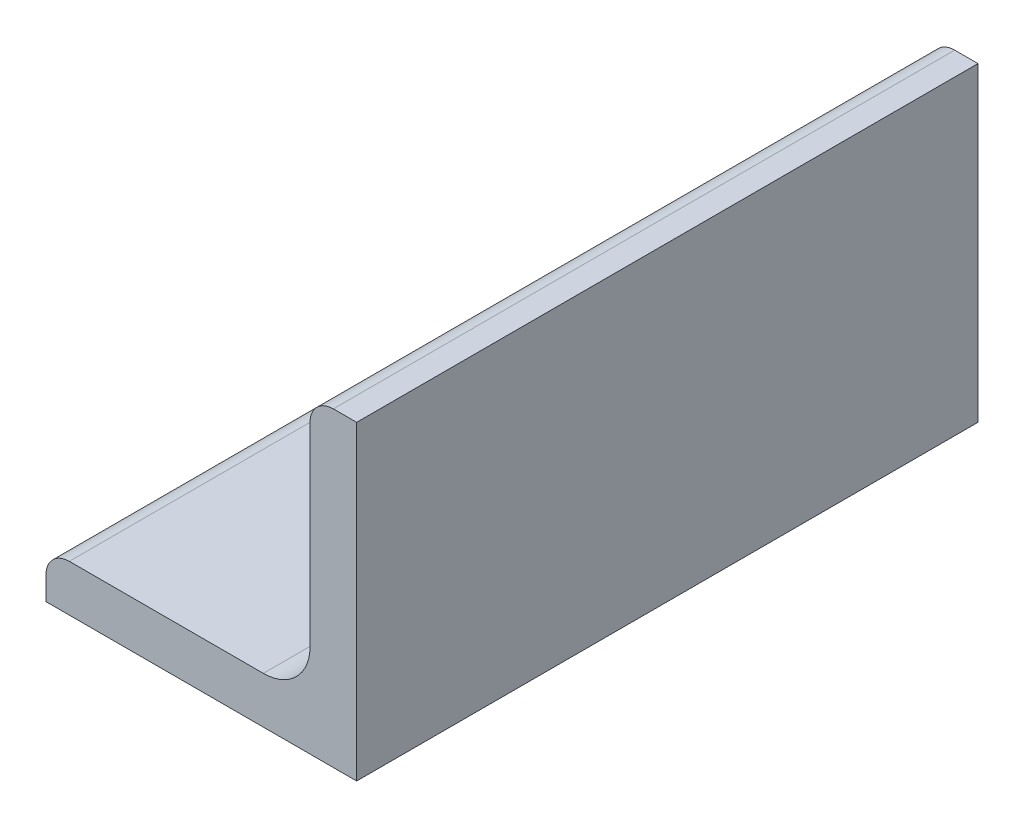
ISO-10303-21;
HEADER;
FILE_DESCRIPTION(('STEP AP214'),'2;1');
FILE_NAME('part.step','',(''),(''),'','','');
FILE_SCHEMA(('AUTOMOTIVE_DESIGN { 1 0 10303 214 1 1 1 1 }'));
ENDSEC;
DATA;
#1=APPLICATION_CONTEXT('core data for automotive mechanical design processes');
#2=APPLICATION_PROTOCOL_DEFINITION('international standard','automotive_design',2000,#1);
#3=PRODUCT_CONTEXT('',#1,'mechanical');
#4=PRODUCT('Part','Part','',(#3));
#5=PRODUCT_RELATED_PRODUCT_CATEGORY('part','',(#4));
#6=PRODUCT_DEFINITION_FORMATION('','',#4);
#7=PRODUCT_DEFINITION_CONTEXT('part definition',#1,'design');
#8=PRODUCT_DEFINITION('design','',#6,#7);
#9=PRODUCT_DEFINITION_SHAPE('','',#8);
#10=(LENGTH_UNIT() NAMED_UNIT(*) SI_UNIT(.MILLI.,.METRE.));
#11=(NAMED_UNIT(*) PLANE_ANGLE_UNIT() SI_UNIT($,.RADIAN.));
#12=(NAMED_UNIT(*) SI_UNIT($,.STERADIAN.) SOLID_ANGLE_UNIT());
#13=UNCERTAINTY_MEASURE_WITH_UNIT(LENGTH_MEASURE(1.E-05),#10,'distance_accuracy_value','');
#14=(GEOMETRIC_REPRESENTATION_CONTEXT(3) GLOBAL_UNCERTAINTY_ASSIGNED_CONTEXT((#13)) GLOBAL_UNIT_ASSIGNED_CONTEXT((#10,
#11,#12)) REPRESENTATION_CONTEXT('',''));
#15=CARTESIAN_POINT('',(0.,0.,0.));
#16=DIRECTION('',(0.,0.,1.));
#17=DIRECTION('',(1.,0.,0.));
#18=AXIS2_PLACEMENT_3D('',#15,#16,#17);
#19=CARTESIAN_POINT('',(-15.875,-13.49375,152.4));
#20=DIRECTION('',(1.,0.,0.));
#21=DIRECTION('',(0.,0.,-1.));
#22=AXIS2_PLACEMENT_3D('',#19,#20,#21);
#23=PLANE('',#22);
#24=DIRECTION('',(0.,0.,-1.));
#25=VECTOR('',#24,1.);
#26=CARTESIAN_POINT('',(-15.875,-13.49375,152.4));
#27=LINE('',#26,#25);
#28=CARTESIAN_POINT('',(-15.875,-13.49375,152.4));
#29=VERTEX_POINT('',#28);
#30=CARTESIAN_POINT('',(-15.875,-13.49375,88.9));
#31=VERTEX_POINT('',#30);
#32=EDGE_CURVE('E150',#29,#31,#27,.T.);
#33=ORIENTED_EDGE('',*,*,#32,.T.);
#34=DIRECTION('',(0.,-1.,0.));
#35=VECTOR('',#34,1.);
#36=CARTESIAN_POINT('',(-15.875,-13.49375,88.9));
#37=LINE('',#36,#35);
#38=CARTESIAN_POINT('',(-15.875,-15.875,88.9));
#39=VERTEX_POINT('',#38);
#40=EDGE_CURVE('E55',#31,#39,#37,.T.);
#41=ORIENTED_EDGE('',*,*,#40,.T.);
#42=DIRECTION('',(0.,0.,-1.));
#43=VECTOR('',#42,1.);
#44=CARTESIAN_POINT('',(-15.875,-15.875,152.4));
#45=LINE('',#44,#43);
#46=CARTESIAN_POINT('',(-15.875,-15.875,152.4));
#47=VERTEX_POINT('',#46);
#48=EDGE_CURVE('E48',#47,#39,#45,.T.);
#49=ORIENTED_EDGE('',*,*,#48,.F.);
#50=DIRECTION('',(0.,-1.,0.));
#51=VECTOR('',#50,1.);
#52=CARTESIAN_POINT('',(-15.875,-13.49375,152.4));
#53=LINE('',#52,#51);
#54=EDGE_CURVE('E167',#29,#47,#53,.T.);
#55=ORIENTED_EDGE('',*,*,#54,.F.);
#56=EDGE_LOOP('',(#33,#41,#49,#55));
#57=FACE_BOUND('',#56,.T.);
#58=ADVANCED_FACE('F41',(#57),#23,.F.);
#59=CARTESIAN_POINT('',(-15.875,-15.875,152.4));
#60=DIRECTION('',(0.,1.,0.));
#61=DIRECTION('',(-1.,0.,0.));
#62=AXIS2_PLACEMENT_3D('',#59,#60,#61);
#63=PLANE('',#62);
#64=ORIENTED_EDGE('',*,*,#48,.T.);
#65=DIRECTION('',(-1.,0.,0.));
#66=VECTOR('',#65,1.);
#67=CARTESIAN_POINT('',(15.875,-15.875,88.9));
#68=LINE('',#67,#66);
#69=CARTESIAN_POINT('',(15.875,-15.875,88.9));
#70=VERTEX_POINT('',#69);
#71=EDGE_CURVE('E112',#70,#39,#68,.T.);
#72=ORIENTED_EDGE('',*,*,#71,.F.);
#73=DIRECTION('',(0.,0.,-1.));
#74=VECTOR('',#73,1.);
#75=CARTESIAN_POINT('',(15.875,-15.875,152.4));
#76=LINE('',#75,#74);
#77=CARTESIAN_POINT('',(15.875,-15.875,152.4));
#78=VERTEX_POINT('',#77);
#79=EDGE_CURVE('E124',#78,#70,#76,.T.);
#80=ORIENTED_EDGE('',*,*,#79,.F.);
#81=DIRECTION('',(1.,0.,0.));
#82=VECTOR('',#81,1.);
#83=CARTESIAN_POINT('',(-15.875,-15.875,152.4));
#84=LINE('',#83,#82);
#85=EDGE_CURVE('E165',#47,#78,#84,.T.);
#86=ORIENTED_EDGE('',*,*,#85,.F.);
#87=EDGE_LOOP('',(#64,#72,#80,#86));
#88=FACE_BOUND('',#87,.T.);
#89=ADVANCED_FACE('F123',(#88),#63,.F.);
#90=CARTESIAN_POINT('',(15.875,-15.875,152.4));
#91=DIRECTION('',(-1.,0.,0.));
#92=DIRECTION('',(0.,-1.,0.));
#93=AXIS2_PLACEMENT_3D('',#90,#91,#92);
#94=PLANE('',#93);
#95=ORIENTED_EDGE('',*,*,#79,.T.);
#96=DIRECTION('',(0.,-1.,0.));
#97=VECTOR('',#96,1.);
#98=CARTESIAN_POINT('',(15.875,-15.875,88.9));
#99=LINE('',#98,#97);
#100=CARTESIAN_POINT('',(15.875,15.875,88.9));
#101=VERTEX_POINT('',#100);
#102=EDGE_CURVE('E109',#101,#70,#99,.T.);
#103=ORIENTED_EDGE('',*,*,#102,.F.);
#104=DIRECTION('',(0.,0.,-1.));
#105=VECTOR('',#104,1.);
#106=CARTESIAN_POINT('',(15.875,15.875,152.4));
#107=LINE('',#106,#105);
#108=CARTESIAN_POINT('',(15.875,15.875,152.4));
#109=VERTEX_POINT('',#108);
#110=EDGE_CURVE('E131',#109,#101,#107,.T.);
#111=ORIENTED_EDGE('',*,*,#110,.F.);
#112=DIRECTION('',(0.,1.,0.));
#113=VECTOR('',#112,1.);
#114=CARTESIAN_POINT('',(15.875,-15.875,152.4));
#115=LINE('',#114,#113);
#116=EDGE_CURVE('E130',#78,#109,#115,.T.);
#117=ORIENTED_EDGE('',*,*,#116,.F.);
#118=EDGE_LOOP('',(#95,#103,#111,#117));
#119=FACE_BOUND('',#118,.T.);
#120=ADVANCED_FACE('F129',(#119),#94,.F.);
#121=CARTESIAN_POINT('',(13.49375,15.875,152.4));
#122=DIRECTION('',(0.,-1.,0.));
#123=DIRECTION('',(1.,0.,0.));
#124=AXIS2_PLACEMENT_3D('',#121,#122,#123);
#125=PLANE('',#124);
#126=ORIENTED_EDGE('',*,*,#110,.T.);
#127=DIRECTION('',(-1.,0.,0.));
#128=VECTOR('',#127,1.);
#129=CARTESIAN_POINT('',(13.49375,15.875,88.9));
#130=LINE('',#129,#128);
#131=CARTESIAN_POINT('',(13.49375,15.875,88.9));
#132=VERTEX_POINT('',#131);
#133=EDGE_CURVE('E114',#101,#132,#130,.T.);
#134=ORIENTED_EDGE('',*,*,#133,.T.);
#135=DIRECTION('',(0.,0.,-1.));
#136=VECTOR('',#135,1.);
#137=CARTESIAN_POINT('',(13.49375,15.875,152.4));
#138=LINE('',#137,#136);
#139=CARTESIAN_POINT('',(13.49375,15.875,152.4));
#140=VERTEX_POINT('',#139);
#141=EDGE_CURVE('E133',#140,#132,#138,.T.);
#142=ORIENTED_EDGE('',*,*,#141,.F.);
#143=DIRECTION('',(-1.,0.,0.));
#144=VECTOR('',#143,1.);
#145=CARTESIAN_POINT('',(13.49375,15.875,152.4));
#146=LINE('',#145,#144);
#147=EDGE_CURVE('E162',#109,#140,#146,.T.);
#148=ORIENTED_EDGE('',*,*,#147,.F.);
#149=EDGE_LOOP('',(#126,#134,#142,#148));
#150=FACE_BOUND('',#149,.T.);
#151=ADVANCED_FACE('F194',(#150),#125,.F.);
#152=CARTESIAN_POINT('',(13.49375,13.49375,152.4));
#153=DIRECTION('',(0.,0.,-1.));
#154=DIRECTION('',(-1.,0.,0.));
#155=AXIS2_PLACEMENT_3D('',#152,#153,#154);
#156=CYLINDRICAL_SURFACE('',#155,2.38125);
#157=ORIENTED_EDGE('',*,*,#141,.T.);
#158=CARTESIAN_POINT('',(13.49375,13.49375,88.9));
#159=DIRECTION('',(0.,0.,1.));
#160=DIRECTION('',(1.,0.,0.));
#161=AXIS2_PLACEMENT_3D('',#158,#159,#160);
#162=CIRCLE('',#161,2.38125);
#163=CARTESIAN_POINT('',(11.1125,13.49375,88.9));
#164=VERTEX_POINT('',#163);
#165=EDGE_CURVE('E171',#132,#164,#162,.T.);
#166=ORIENTED_EDGE('',*,*,#165,.T.);
#167=DIRECTION('',(0.,0.,-1.));
#168=VECTOR('',#167,1.);
#169=CARTESIAN_POINT('',(11.1125,13.49375,152.4));
#170=LINE('',#169,#168);
#171=CARTESIAN_POINT('',(11.1125,13.49375,152.4));
#172=VERTEX_POINT('',#171);
#173=EDGE_CURVE('E138',#172,#164,#170,.T.);
#174=ORIENTED_EDGE('',*,*,#173,.F.);
#175=CARTESIAN_POINT('',(13.49375,13.49375,152.4));
#176=DIRECTION('',(0.,0.,1.));
#177=DIRECTION('',(-1.,0.,0.));
#178=AXIS2_PLACEMENT_3D('',#175,#176,#177);
#179=CIRCLE('',#178,2.38125);
#180=EDGE_CURVE('E160',#140,#172,#179,.T.);
#181=ORIENTED_EDGE('',*,*,#180,.F.);
#182=EDGE_LOOP('',(#157,#166,#174,#181));
#183=FACE_BOUND('',#182,.T.);
#184=ADVANCED_FACE('F198',(#183),#156,.T.);
#185=CARTESIAN_POINT('',(11.1125,13.49375,152.4));
#186=DIRECTION('',(1.,0.,0.));
#187=DIRECTION('',(0.,1.,0.));
#188=AXIS2_PLACEMENT_3D('',#185,#186,#187);
#189=PLANE('',#188);
#190=ORIENTED_EDGE('',*,*,#173,.T.);
#191=DIRECTION('',(0.,-1.,0.));
#192=VECTOR('',#191,1.);
#193=CARTESIAN_POINT('',(11.1125,13.49375,88.9));
#194=LINE('',#193,#192);
#195=CARTESIAN_POINT('',(11.1125,-6.33729999999999,88.9));
#196=VERTEX_POINT('',#195);
#197=EDGE_CURVE('E174',#164,#196,#194,.T.);
#198=ORIENTED_EDGE('',*,*,#197,.T.);
#199=DIRECTION('',(0.,0.,-1.));
#200=VECTOR('',#199,1.);
#201=CARTESIAN_POINT('',(11.1125,-6.33729999999999,152.4));
#202=LINE('',#201,#200);
#203=CARTESIAN_POINT('',(11.1125,-6.33729999999999,152.4));
#204=VERTEX_POINT('',#203);
#205=EDGE_CURVE('E141',#204,#196,#202,.T.);
#206=ORIENTED_EDGE('',*,*,#205,.F.);
#207=DIRECTION('',(0.,-1.,0.));
#208=VECTOR('',#207,1.);
#209=CARTESIAN_POINT('',(11.1125,13.49375,152.4));
#210=LINE('',#209,#208);
#211=EDGE_CURVE('E158',#172,#204,#210,.T.);
#212=ORIENTED_EDGE('',*,*,#211,.F.);
#213=EDGE_LOOP('',(#190,#198,#206,#212));
#214=FACE_BOUND('',#213,.T.);
#215=ADVANCED_FACE('F203',(#214),#189,.F.);
#216=CARTESIAN_POINT('',(6.3373,-6.33729999999999,152.4));
#217=DIRECTION('',(0.,0.,-1.));
#218=DIRECTION('',(-1.,0.,0.));
#219=AXIS2_PLACEMENT_3D('',#216,#217,#218);
#220=CYLINDRICAL_SURFACE('',#219,4.7752);
#221=ORIENTED_EDGE('',*,*,#205,.T.);
#222=CARTESIAN_POINT('',(6.3373,-6.33729999999999,88.9));
#223=DIRECTION('',(0.,0.,1.));
#224=DIRECTION('',(1.,0.,0.));
#225=AXIS2_PLACEMENT_3D('',#222,#223,#224);
#226=CIRCLE('',#225,4.7752);
#227=CARTESIAN_POINT('',(6.3373,-11.1125,88.9));
#228=VERTEX_POINT('',#227);
#229=EDGE_CURVE('E177',#196,#228,#226,.F.);
#230=ORIENTED_EDGE('',*,*,#229,.T.);
#231=DIRECTION('',(0.,0.,-1.));
#232=VECTOR('',#231,1.);
#233=CARTESIAN_POINT('',(6.3373,-11.1125,152.4));
#234=LINE('',#233,#232);
#235=CARTESIAN_POINT('',(6.3373,-11.1125,152.4));
#236=VERTEX_POINT('',#235);
#237=EDGE_CURVE('E144',#236,#228,#234,.T.);
#238=ORIENTED_EDGE('',*,*,#237,.F.);
#239=CARTESIAN_POINT('',(6.3373,-6.33729999999999,152.4));
#240=DIRECTION('',(0.,0.,-1.));
#241=DIRECTION('',(-1.,0.,0.));
#242=AXIS2_PLACEMENT_3D('',#239,#240,#241);
#243=CIRCLE('',#242,4.7752);
#244=EDGE_CURVE('E156',#204,#236,#243,.T.);
#245=ORIENTED_EDGE('',*,*,#244,.F.);
#246=EDGE_LOOP('',(#221,#230,#238,#245));
#247=FACE_BOUND('',#246,.T.);
#248=ADVANCED_FACE('F205',(#247),#220,.F.);
#249=CARTESIAN_POINT('',(6.3373,-11.1125,152.4));
#250=DIRECTION('',(0.,-1.,0.));
#251=DIRECTION('',(1.,0.,0.));
#252=AXIS2_PLACEMENT_3D('',#249,#250,#251);
#253=PLANE('',#252);
#254=ORIENTED_EDGE('',*,*,#237,.T.);
#255=DIRECTION('',(-1.,0.,0.));
#256=VECTOR('',#255,1.);
#257=CARTESIAN_POINT('',(6.3373,-11.1125,88.9));
#258=LINE('',#257,#256);
#259=CARTESIAN_POINT('',(-13.49375,-11.1125,88.9));
#260=VERTEX_POINT('',#259);
#261=EDGE_CURVE('E127',#228,#260,#258,.T.);
#262=ORIENTED_EDGE('',*,*,#261,.T.);
#263=DIRECTION('',(0.,0.,-1.));
#264=VECTOR('',#263,1.);
#265=CARTESIAN_POINT('',(-13.49375,-11.1125,152.4));
#266=LINE('',#265,#264);
#267=CARTESIAN_POINT('',(-13.49375,-11.1125,152.4));
#268=VERTEX_POINT('',#267);
#269=EDGE_CURVE('E147',#268,#260,#266,.T.);
#270=ORIENTED_EDGE('',*,*,#269,.F.);
#271=DIRECTION('',(-1.,0.,0.));
#272=VECTOR('',#271,1.);
#273=CARTESIAN_POINT('',(6.3373,-11.1125,152.4));
#274=LINE('',#273,#272);
#275=EDGE_CURVE('E154',#236,#268,#274,.T.);
#276=ORIENTED_EDGE('',*,*,#275,.F.);
#277=EDGE_LOOP('',(#254,#262,#270,#276));
#278=FACE_BOUND('',#277,.T.);
#279=ADVANCED_FACE('F183',(#278),#253,.F.);
#280=CARTESIAN_POINT('',(-13.49375,-13.49375,152.4));
#281=DIRECTION('',(0.,0.,-1.));
#282=DIRECTION('',(-1.,0.,0.));
#283=AXIS2_PLACEMENT_3D('',#280,#281,#282);
#284=CYLINDRICAL_SURFACE('',#283,2.38125);
#285=ORIENTED_EDGE('',*,*,#269,.T.);
#286=CARTESIAN_POINT('',(-13.49375,-13.49375,88.9));
#287=DIRECTION('',(0.,0.,1.));
#288=DIRECTION('',(1.,0.,0.));
#289=AXIS2_PLACEMENT_3D('',#286,#287,#288);
#290=CIRCLE('',#289,2.38125);
#291=EDGE_CURVE('E11',#260,#31,#290,.T.);
#292=ORIENTED_EDGE('',*,*,#291,.T.);
#293=ORIENTED_EDGE('',*,*,#32,.F.);
#294=CARTESIAN_POINT('',(-13.49375,-13.49375,152.4));
#295=DIRECTION('',(0.,0.,1.));
#296=DIRECTION('',(-1.,0.,0.));
#297=AXIS2_PLACEMENT_3D('',#294,#295,#296);
#298=CIRCLE('',#297,2.38125);
#299=EDGE_CURVE('E62',#268,#29,#298,.T.);
#300=ORIENTED_EDGE('',*,*,#299,.F.);
#301=EDGE_LOOP('',(#285,#292,#293,#300));
#302=FACE_BOUND('',#301,.T.);
#303=ADVANCED_FACE('F187',(#302),#284,.T.);
#304=CARTESIAN_POINT('',(13.49375,13.49375,152.4));
#305=DIRECTION('',(0.,0.,-1.));
#306=DIRECTION('',(-1.,0.,0.));
#307=AXIS2_PLACEMENT_3D('',#304,#305,#306);
#308=PLANE('',#307);
#309=ORIENTED_EDGE('',*,*,#54,.T.);
#310=ORIENTED_EDGE('',*,*,#85,.T.);
#311=ORIENTED_EDGE('',*,*,#116,.T.);
#312=ORIENTED_EDGE('',*,*,#147,.T.);
#313=ORIENTED_EDGE('',*,*,#180,.T.);
#314=ORIENTED_EDGE('',*,*,#211,.T.);
#315=ORIENTED_EDGE('',*,*,#244,.T.);
#316=ORIENTED_EDGE('',*,*,#275,.T.);
#317=ORIENTED_EDGE('',*,*,#299,.T.);
#318=EDGE_LOOP('',(#309,#310,#311,#312,#313,#314,#315,#316,#317));
#319=FACE_BOUND('',#318,.T.);
#320=ADVANCED_FACE('F190',(#319),#308,.F.);
#321=CARTESIAN_POINT('',(0.,0.,88.9));
#322=DIRECTION('',(0.,0.,1.));
#323=DIRECTION('',(1.,0.,0.));
#324=AXIS2_PLACEMENT_3D('',#321,#322,#323);
#325=PLANE('',#324);
#326=ORIENTED_EDGE('',*,*,#291,.F.);
#327=ORIENTED_EDGE('',*,*,#261,.F.);
#328=ORIENTED_EDGE('',*,*,#229,.F.);
#329=ORIENTED_EDGE('',*,*,#197,.F.);
#330=ORIENTED_EDGE('',*,*,#165,.F.);
#331=ORIENTED_EDGE('',*,*,#133,.F.);
#332=ORIENTED_EDGE('',*,*,#102,.T.);
#333=ORIENTED_EDGE('',*,*,#71,.T.);
#334=ORIENTED_EDGE('',*,*,#40,.F.);
#335=EDGE_LOOP('',(#326,#327,#328,#329,#330,#331,#332,#333,#334));
#336=FACE_BOUND('',#335,.T.);
#337=ADVANCED_FACE('F111',(#336),#325,.F.);
#338=CLOSED_SHELL('',(#58,#89,#120,#151,#184,#215,#248,#279,#303,#320,#337));
#339=MANIFOLD_SOLID_BREP('B2',#338);
#340=ADVANCED_BREP_SHAPE_REPRESENTATION('',(#18,#339),#14);
#341=SHAPE_DEFINITION_REPRESENTATION(#9,#340);
ENDSEC;
END-ISO-10303-21;
